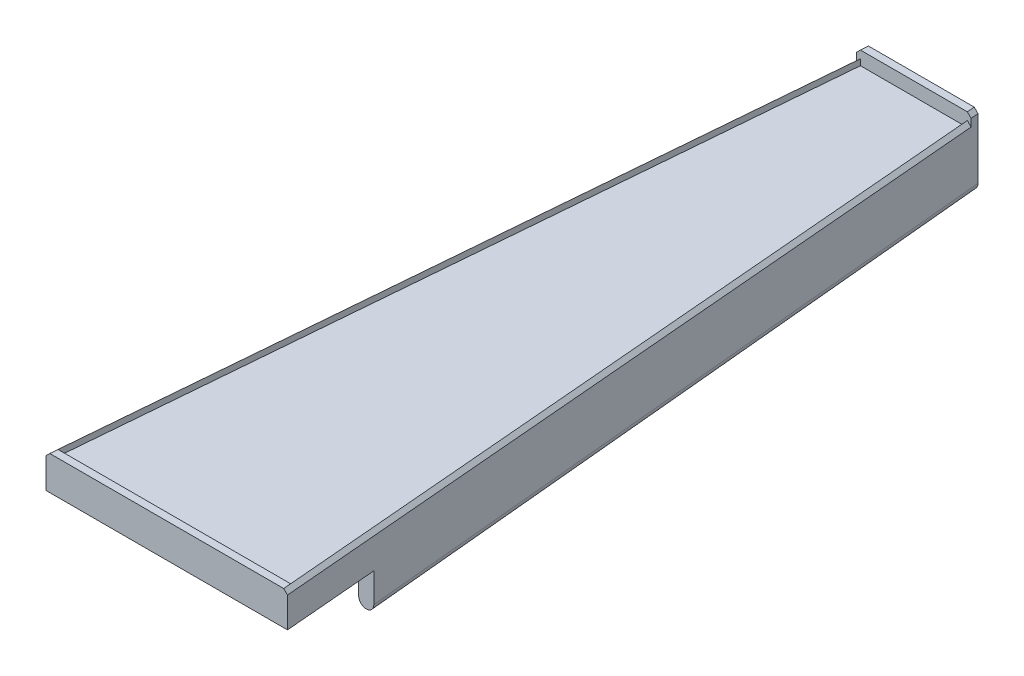
ISO-10303-21;
HEADER;
FILE_DESCRIPTION(('STEP AP214'),'2;1');
FILE_NAME('part.step','',(''),(''),'','','');
FILE_SCHEMA(('AUTOMOTIVE_DESIGN { 1 0 10303 214 1 1 1 1 }'));
ENDSEC;
DATA;
#1=APPLICATION_CONTEXT('core data for automotive mechanical design processes');
#2=APPLICATION_PROTOCOL_DEFINITION('international standard','automotive_design',2000,#1);
#3=PRODUCT_CONTEXT('',#1,'mechanical');
#4=PRODUCT('Part','Part','',(#3));
#5=PRODUCT_RELATED_PRODUCT_CATEGORY('part','',(#4));
#6=PRODUCT_DEFINITION_FORMATION('','',#4);
#7=PRODUCT_DEFINITION_CONTEXT('part definition',#1,'design');
#8=PRODUCT_DEFINITION('design','',#6,#7);
#9=PRODUCT_DEFINITION_SHAPE('','',#8);
#10=(LENGTH_UNIT() NAMED_UNIT(*) SI_UNIT(.MILLI.,.METRE.));
#11=(NAMED_UNIT(*) PLANE_ANGLE_UNIT() SI_UNIT($,.RADIAN.));
#12=(NAMED_UNIT(*) SI_UNIT($,.STERADIAN.) SOLID_ANGLE_UNIT());
#13=UNCERTAINTY_MEASURE_WITH_UNIT(LENGTH_MEASURE(1.E-05),#10,'distance_accuracy_value','');
#14=(GEOMETRIC_REPRESENTATION_CONTEXT(3) GLOBAL_UNCERTAINTY_ASSIGNED_CONTEXT((#13)) GLOBAL_UNIT_ASSIGNED_CONTEXT((#10,
#11,#12)) REPRESENTATION_CONTEXT('',''));
#15=CARTESIAN_POINT('',(0.,0.,0.));
#16=DIRECTION('',(0.,0.,1.));
#17=DIRECTION('',(1.,0.,0.));
#18=AXIS2_PLACEMENT_3D('',#15,#16,#17);
#19=CARTESIAN_POINT('',(-13.0071860837691,3.99840610567133,0.169389182879624));
#20=DIRECTION('',(-0.0846903873997294,-0.00996357498820347,0.996357498820347));
#21=DIRECTION('',(0.99640695811543,0.,0.0846945914398114));
#22=AXIS2_PLACEMENT_3D('',#19,#20,#21);
#23=CYLINDRICAL_SURFACE('',#22,2.);
#24=CARTESIAN_POINT('',(-27.8677880032243,2.25009999750012,175.));
#25=DIRECTION('',(0.,0.,-1.));
#26=DIRECTION('',(-0.993150604322876,-0.116841247567397,0.));
#27=AXIS2_PLACEMENT_3D('',#24,#25,#26);
#28=ELLIPSE('',#27,2.00731163499841,2.);
#29=CARTESIAN_POINT('',(-29.875,2.24840610567133,175.));
#30=VERTEX_POINT('',#29);
#31=CARTESIAN_POINT('',(-25.8605760064487,2.25179388932892,175.));
#32=VERTEX_POINT('',#31);
#33=EDGE_CURVE('E348',#30,#32,#28,.F.);
#34=ORIENTED_EDGE('',*,*,#33,.F.);
#35=DIRECTION('',(-0.0846903873997294,-0.00996357498820347,0.996357498820347));
#36=VECTOR('',#35,1.);
#37=CARTESIAN_POINT('',(-31.9856537316058,2.000093901953,199.831220371833));
#38=LINE('',#37,#36);
#39=CARTESIAN_POINT('',(-15.,3.99840610567133,0.));
#40=VERTEX_POINT('',#39);
#41=EDGE_CURVE('E237',#40,#30,#38,.T.);
#42=ORIENTED_EDGE('',*,*,#41,.F.);
#43=CARTESIAN_POINT('',(-12.9927880032244,4.00009999750012,0.));
#44=DIRECTION('',(0.,0.,1.));
#45=DIRECTION('',(-0.993150604322876,-0.116841247567397,0.));
#46=AXIS2_PLACEMENT_3D('',#43,#44,#45);
#47=ELLIPSE('',#46,2.00731163499841,2.);
#48=CARTESIAN_POINT('',(-12.9944879182308,2.,0.));
#49=VERTEX_POINT('',#48);
#50=EDGE_CURVE('E245',#49,#40,#47,.F.);
#51=ORIENTED_EDGE('',*,*,#50,.F.);
#52=DIRECTION('',(-0.0846903873997294,-0.00996357498820347,0.996357498820347));
#53=VECTOR('',#52,1.);
#54=CARTESIAN_POINT('',(-13.1308042260666,1.98396278731343,1.60372126865746));
#55=LINE('',#54,#53);
#56=CARTESIAN_POINT('',(-13.3344879182307,1.96,4.));
#57=VERTEX_POINT('',#56);
#58=EDGE_CURVE('E240',#57,#49,#55,.F.);
#59=ORIENTED_EDGE('',*,*,#58,.F.);
#60=CARTESIAN_POINT('',(-13.3327880032244,3.96009999750012,4.));
#61=DIRECTION('',(0.,0.,1.));
#62=DIRECTION('',(-0.993150604322876,-0.116841247567397,0.));
#63=AXIS2_PLACEMENT_3D('',#60,#61,#62);
#64=ELLIPSE('',#63,2.00731163499841,2.);
#65=CARTESIAN_POINT('',(-11.3255760064487,3.96179388932892,4.));
#66=VERTEX_POINT('',#65);
#67=EDGE_CURVE('E248',#66,#57,#64,.F.);
#68=ORIENTED_EDGE('',*,*,#67,.F.);
#69=DIRECTION('',(0.0846903873997294,0.00996357498820347,-0.996357498820347));
#70=VECTOR('',#69,1.);
#71=CARTESIAN_POINT('',(-11.0143721675383,3.99840610567133,0.338778365759247));
#72=LINE('',#71,#70);
#73=EDGE_CURVE('E243',#32,#66,#72,.T.);
#74=ORIENTED_EDGE('',*,*,#73,.F.);
#75=EDGE_LOOP('',(#34,#42,#51,#59,#68,#74));
#76=FACE_BOUND('',#75,.T.);
#77=ADVANCED_FACE('F37',(#76),#23,.T.);
#78=CARTESIAN_POINT('',(-32.,2.,0.));
#79=DIRECTION('',(0.,0.999950003749687,0.00999950003749687));
#80=DIRECTION('',(0.,-0.00999950003749688,0.999950003749688));
#81=AXIS2_PLACEMENT_3D('',#78,#79,#80);
#82=PLANE('',#81);
#83=DIRECTION('',(1.,0.,0.));
#84=VECTOR('',#83,1.);
#85=CARTESIAN_POINT('',(-32.,1.96,4.));
#86=LINE('',#85,#84);
#87=CARTESIAN_POINT('',(13.3344879182308,1.96,4.));
#88=VERTEX_POINT('',#87);
#89=EDGE_CURVE('E325',#57,#88,#86,.T.);
#90=ORIENTED_EDGE('',*,*,#89,.F.);
#91=ORIENTED_EDGE('',*,*,#58,.T.);
#92=DIRECTION('',(1.,0.,0.));
#93=VECTOR('',#92,1.);
#94=CARTESIAN_POINT('',(-32.,2.,0.));
#95=LINE('',#94,#93);
#96=CARTESIAN_POINT('',(12.9944879182308,2.,0.));
#97=VERTEX_POINT('',#96);
#98=EDGE_CURVE('E329',#49,#97,#95,.T.);
#99=ORIENTED_EDGE('',*,*,#98,.T.);
#100=DIRECTION('',(-0.0846903873997296,0.00996357498820347,-0.996357498820347));
#101=VECTOR('',#100,1.);
#102=CARTESIAN_POINT('',(12.67176667612,2.03796720495421,-3.79672049542066));
#103=LINE('',#102,#101);
#104=EDGE_CURVE('E229',#97,#88,#103,.F.);
#105=ORIENTED_EDGE('',*,*,#104,.T.);
#106=EDGE_LOOP('',(#90,#91,#99,#105));
#107=FACE_BOUND('',#106,.T.);
#108=ADVANCED_FACE('F415',(#107),#82,.F.);
#109=CARTESIAN_POINT('',(30.0071860837692,1.99840610567133,200.16938918288));
#110=DIRECTION('',(-0.0846903873997296,0.00996357498820347,-0.996357498820347));
#111=DIRECTION('',(-0.99640695811543,0.,0.0846945914398116));
#112=AXIS2_PLACEMENT_3D('',#109,#110,#111);
#113=CYLINDRICAL_SURFACE('',#112,2.);
#114=CARTESIAN_POINT('',(27.8677880032244,2.25009999750013,175.));
#115=DIRECTION('',(0.,0.,-1.));
#116=DIRECTION('',(-0.993150604322876,0.116841247567397,0.));
#117=AXIS2_PLACEMENT_3D('',#114,#115,#116);
#118=ELLIPSE('',#117,2.00731163499841,2.);
#119=CARTESIAN_POINT('',(25.8605760064488,2.25179388932892,175.));
#120=VERTEX_POINT('',#119);
#121=CARTESIAN_POINT('',(29.875,2.24840610567133,175.));
#122=VERTEX_POINT('',#121);
#123=EDGE_CURVE('E291',#120,#122,#118,.F.);
#124=ORIENTED_EDGE('',*,*,#123,.F.);
#125=DIRECTION('',(0.0846903873997296,-0.00996357498820347,0.996357498820347));
#126=VECTOR('',#125,1.);
#127=CARTESIAN_POINT('',(28.0143721675383,1.99840610567133,200.338778365759));
#128=LINE('',#127,#126);
#129=CARTESIAN_POINT('',(11.3255760064487,3.96179388932892,4.));
#130=VERTEX_POINT('',#129);
#131=EDGE_CURVE('E232',#130,#120,#128,.T.);
#132=ORIENTED_EDGE('',*,*,#131,.F.);
#133=CARTESIAN_POINT('',(13.3327880032244,3.96009999750013,4.));
#134=DIRECTION('',(0.,0.,1.));
#135=DIRECTION('',(-0.993150604322876,0.116841247567397,0.));
#136=AXIS2_PLACEMENT_3D('',#133,#134,#135);
#137=ELLIPSE('',#136,2.00731163499841,2.);
#138=EDGE_CURVE('E235',#88,#130,#137,.F.);
#139=ORIENTED_EDGE('',*,*,#138,.F.);
#140=ORIENTED_EDGE('',*,*,#104,.F.);
#141=CARTESIAN_POINT('',(12.9927880032244,4.00009999750013,0.));
#142=DIRECTION('',(0.,0.,1.));
#143=DIRECTION('',(-0.993150604322876,0.116841247567397,0.));
#144=AXIS2_PLACEMENT_3D('',#141,#142,#143);
#145=ELLIPSE('',#144,2.00731163499841,2.);
#146=CARTESIAN_POINT('',(15.,3.99840610567133,0.));
#147=VERTEX_POINT('',#146);
#148=EDGE_CURVE('E226',#147,#97,#145,.F.);
#149=ORIENTED_EDGE('',*,*,#148,.F.);
#150=DIRECTION('',(-0.0846903873997296,0.00996357498820347,-0.996357498820347));
#151=VECTOR('',#150,1.);
#152=CARTESIAN_POINT('',(31.9856537316058,2.000093901953,199.831220371833));
#153=LINE('',#152,#151);
#154=EDGE_CURVE('E218',#122,#147,#153,.T.);
#155=ORIENTED_EDGE('',*,*,#154,.F.);
#156=EDGE_LOOP('',(#124,#132,#139,#140,#149,#155));
#157=FACE_BOUND('',#156,.T.);
#158=ADVANCED_FACE('F297',(#157),#113,.T.);
#159=CARTESIAN_POINT('',(-32.,19.,200.));
#160=DIRECTION('',(0.99640695811543,0.,0.0846945914398114));
#161=DIRECTION('',(0.0846945914398114,0.,-0.99640695811543));
#162=AXIS2_PLACEMENT_3D('',#159,#160,#161);
#163=PLANE('',#162);
#164=DIRECTION('',(0.,1.,0.));
#165=VECTOR('',#164,1.);
#166=CARTESIAN_POINT('',(-29.875,19.,175.));
#167=LINE('',#166,#165);
#168=CARTESIAN_POINT('',(-29.875,9.99920305283565,175.));
#169=VERTEX_POINT('',#168);
#170=EDGE_CURVE('E352',#30,#169,#167,.T.);
#171=ORIENTED_EDGE('',*,*,#170,.T.);
#172=DIRECTION('',(-0.0846945914398114,0.,0.99640695811543));
#173=VECTOR('',#172,1.);
#174=CARTESIAN_POINT('',(-32.,9.99920305283565,200.));
#175=LINE('',#174,#173);
#176=CARTESIAN_POINT('',(-32.,9.99920305283565,200.));
#177=VERTEX_POINT('',#176);
#178=EDGE_CURVE('E200',#169,#177,#175,.T.);
#179=ORIENTED_EDGE('',*,*,#178,.T.);
#180=DIRECTION('',(0.,-1.,0.));
#181=VECTOR('',#180,1.);
#182=CARTESIAN_POINT('',(-32.,19.,200.));
#183=LINE('',#182,#181);
#184=CARTESIAN_POINT('',(-32.,18.,200.));
#185=VERTEX_POINT('',#184);
#186=EDGE_CURVE('E210',#185,#177,#183,.T.);
#187=ORIENTED_EDGE('',*,*,#186,.F.);
#188=DIRECTION('',(0.0846945914398114,0.,-0.99640695811543));
#189=VECTOR('',#188,1.);
#190=CARTESIAN_POINT('',(-15.1692558885214,18.,1.9912457473105));
#191=LINE('',#190,#189);
#192=CARTESIAN_POINT('',(-15.1692558885214,18.,1.99124574731051));
#193=VERTEX_POINT('',#192);
#194=EDGE_CURVE('E263',#185,#193,#191,.T.);
#195=ORIENTED_EDGE('',*,*,#194,.T.);
#196=DIRECTION('',(0.,-1.,0.));
#197=VECTOR('',#196,1.);
#198=CARTESIAN_POINT('',(-15.1692558885214,21.,1.99124574731051));
#199=LINE('',#198,#197);
#200=CARTESIAN_POINT('',(-15.1692558885214,20.,1.99124574731051));
#201=VERTEX_POINT('',#200);
#202=EDGE_CURVE('E328',#201,#193,#199,.T.);
#203=ORIENTED_EDGE('',*,*,#202,.F.);
#204=DIRECTION('',(0.0846945914398114,0.,-0.99640695811543));
#205=VECTOR('',#204,1.);
#206=CARTESIAN_POINT('',(-15.,20.,0.));
#207=LINE('',#206,#205);
#208=CARTESIAN_POINT('',(-15.,20.,0.));
#209=VERTEX_POINT('',#208);
#210=EDGE_CURVE('E287',#201,#209,#207,.T.);
#211=ORIENTED_EDGE('',*,*,#210,.T.);
#212=DIRECTION('',(0.,-1.,0.));
#213=VECTOR('',#212,1.);
#214=CARTESIAN_POINT('',(-15.,19.,0.));
#215=LINE('',#214,#213);
#216=EDGE_CURVE('E221',#209,#40,#215,.T.);
#217=ORIENTED_EDGE('',*,*,#216,.T.);
#218=ORIENTED_EDGE('',*,*,#41,.T.);
#219=EDGE_LOOP('',(#171,#179,#187,#195,#203,#211,#217,#218));
#220=FACE_BOUND('',#219,.T.);
#221=ADVANCED_FACE('F336',(#220),#163,.F.);
#222=CARTESIAN_POINT('',(32.,19.,200.));
#223=DIRECTION('',(0.,0.,-1.));
#224=DIRECTION('',(-1.,0.,0.));
#225=AXIS2_PLACEMENT_3D('',#222,#223,#224);
#226=PLANE('',#225);
#227=ORIENTED_EDGE('',*,*,#186,.T.);
#228=DIRECTION('',(-1.,0.,0.));
#229=VECTOR('',#228,1.);
#230=CARTESIAN_POINT('',(-32.,9.99920305283565,200.));
#231=LINE('',#230,#229);
#232=CARTESIAN_POINT('',(32.,9.99920305283566,200.));
#233=VERTEX_POINT('',#232);
#234=EDGE_CURVE('E195',#233,#177,#231,.T.);
#235=ORIENTED_EDGE('',*,*,#234,.F.);
#236=DIRECTION('',(0.,-1.,0.));
#237=VECTOR('',#236,1.);
#238=CARTESIAN_POINT('',(32.,19.,200.));
#239=LINE('',#238,#237);
#240=CARTESIAN_POINT('',(32.,18.,200.));
#241=VERTEX_POINT('',#240);
#242=EDGE_CURVE('E207',#241,#233,#239,.T.);
#243=ORIENTED_EDGE('',*,*,#242,.F.);
#244=DIRECTION('',(-0.708378252354539,0.705833019623713,0.));
#245=VECTOR('',#244,1.);
#246=CARTESIAN_POINT('',(22.4154183029927,27.550143893524,200.));
#247=LINE('',#246,#245);
#248=CARTESIAN_POINT('',(30.9963940016122,19.,200.));
#249=VERTEX_POINT('',#248);
#250=EDGE_CURVE('E261',#241,#249,#247,.T.);
#251=ORIENTED_EDGE('',*,*,#250,.T.);
#252=DIRECTION('',(1.,0.,0.));
#253=VECTOR('',#252,1.);
#254=CARTESIAN_POINT('',(32.,19.,200.));
#255=LINE('',#254,#253);
#256=CARTESIAN_POINT('',(-30.9963940016121,19.,200.));
#257=VERTEX_POINT('',#256);
#258=EDGE_CURVE('E331',#257,#249,#255,.T.);
#259=ORIENTED_EDGE('',*,*,#258,.F.);
#260=DIRECTION('',(-0.708378252354539,-0.705833019623713,0.));
#261=VECTOR('',#260,1.);
#262=CARTESIAN_POINT('',(-22.4154183029926,27.5501438935239,200.));
#263=LINE('',#262,#261);
#264=EDGE_CURVE('E259',#257,#185,#263,.T.);
#265=ORIENTED_EDGE('',*,*,#264,.T.);
#266=EDGE_LOOP('',(#227,#235,#243,#251,#259,#265));
#267=FACE_BOUND('',#266,.T.);
#268=ADVANCED_FACE('F206',(#267),#226,.F.);
#269=CARTESIAN_POINT('',(32.,19.,200.));
#270=DIRECTION('',(-0.99640695811543,0.,0.0846945914398116));
#271=DIRECTION('',(0.0846945914398116,0.,0.99640695811543));
#272=AXIS2_PLACEMENT_3D('',#269,#270,#271);
#273=PLANE('',#272);
#274=ORIENTED_EDGE('',*,*,#242,.T.);
#275=DIRECTION('',(-0.0846945914398116,0.,-0.99640695811543));
#276=VECTOR('',#275,1.);
#277=CARTESIAN_POINT('',(32.,9.99920305283566,200.));
#278=LINE('',#277,#276);
#279=CARTESIAN_POINT('',(29.875,9.99920305283566,175.));
#280=VERTEX_POINT('',#279);
#281=EDGE_CURVE('E191',#233,#280,#278,.T.);
#282=ORIENTED_EDGE('',*,*,#281,.T.);
#283=DIRECTION('',(0.,-1.,0.));
#284=VECTOR('',#283,1.);
#285=CARTESIAN_POINT('',(29.875,19.,175.));
#286=LINE('',#285,#284);
#287=EDGE_CURVE('E301',#280,#122,#286,.T.);
#288=ORIENTED_EDGE('',*,*,#287,.T.);
#289=ORIENTED_EDGE('',*,*,#154,.T.);
#290=DIRECTION('',(0.,-1.,0.));
#291=VECTOR('',#290,1.);
#292=CARTESIAN_POINT('',(15.,19.,0.));
#293=LINE('',#292,#291);
#294=CARTESIAN_POINT('',(15.,20.,0.));
#295=VERTEX_POINT('',#294);
#296=EDGE_CURVE('E216',#295,#147,#293,.T.);
#297=ORIENTED_EDGE('',*,*,#296,.F.);
#298=DIRECTION('',(0.0846945914398116,0.,0.99640695811543));
#299=VECTOR('',#298,1.);
#300=CARTESIAN_POINT('',(15.1692558885214,20.,1.99124574731051));
#301=LINE('',#300,#299);
#302=CARTESIAN_POINT('',(15.1692558885214,20.,1.99124574731051));
#303=VERTEX_POINT('',#302);
#304=EDGE_CURVE('E282',#295,#303,#301,.T.);
#305=ORIENTED_EDGE('',*,*,#304,.T.);
#306=DIRECTION('',(0.,-1.,0.));
#307=VECTOR('',#306,1.);
#308=CARTESIAN_POINT('',(15.1692558885214,21.,1.99124574731051));
#309=LINE('',#308,#307);
#310=CARTESIAN_POINT('',(15.1692558885214,18.,1.99124574731051));
#311=VERTEX_POINT('',#310);
#312=EDGE_CURVE('E395',#303,#311,#309,.T.);
#313=ORIENTED_EDGE('',*,*,#312,.T.);
#314=DIRECTION('',(0.0846945914398116,0.,0.99640695811543));
#315=VECTOR('',#314,1.);
#316=CARTESIAN_POINT('',(32.,18.,200.));
#317=LINE('',#316,#315);
#318=EDGE_CURVE('E215',#311,#241,#317,.T.);
#319=ORIENTED_EDGE('',*,*,#318,.T.);
#320=EDGE_LOOP('',(#274,#282,#288,#289,#297,#305,#313,#319));
#321=FACE_BOUND('',#320,.T.);
#322=ADVANCED_FACE('F213',(#321),#273,.F.);
#323=CARTESIAN_POINT('',(15.,19.,0.));
#324=DIRECTION('',(0.,0.,1.));
#325=DIRECTION('',(1.,0.,0.));
#326=AXIS2_PLACEMENT_3D('',#323,#324,#325);
#327=PLANE('',#326);
#328=DIRECTION('',(-1.,0.,0.));
#329=VECTOR('',#328,1.);
#330=CARTESIAN_POINT('',(15.,21.,0.));
#331=LINE('',#330,#329);
#332=CARTESIAN_POINT('',(13.9963940016121,21.,0.));
#333=VERTEX_POINT('',#332);
#334=CARTESIAN_POINT('',(-13.9963940016122,21.,0.));
#335=VERTEX_POINT('',#334);
#336=EDGE_CURVE('E384',#333,#335,#331,.T.);
#337=ORIENTED_EDGE('',*,*,#336,.F.);
#338=DIRECTION('',(0.708378252354546,-0.705833019623706,0.));
#339=VECTOR('',#338,1.);
#340=CARTESIAN_POINT('',(13.9460140259434,21.050198958306,0.));
#341=LINE('',#340,#339);
#342=EDGE_CURVE('E280',#333,#295,#341,.T.);
#343=ORIENTED_EDGE('',*,*,#342,.T.);
#344=ORIENTED_EDGE('',*,*,#296,.T.);
#345=ORIENTED_EDGE('',*,*,#148,.T.);
#346=ORIENTED_EDGE('',*,*,#98,.F.);
#347=ORIENTED_EDGE('',*,*,#50,.T.);
#348=ORIENTED_EDGE('',*,*,#216,.F.);
#349=DIRECTION('',(0.708378252354538,0.705833019623714,0.));
#350=VECTOR('',#349,1.);
#351=CARTESIAN_POINT('',(-13.9460140259434,21.050198958306,0.));
#352=LINE('',#351,#350);
#353=EDGE_CURVE('E278',#209,#335,#352,.T.);
#354=ORIENTED_EDGE('',*,*,#353,.T.);
#355=EDGE_LOOP('',(#337,#343,#344,#345,#346,#347,#348,#354));
#356=FACE_BOUND('',#355,.T.);
#357=ADVANCED_FACE('F343',(#356),#327,.F.);
#358=CARTESIAN_POINT('',(0.,19.,0.));
#359=DIRECTION('',(0.,1.,0.));
#360=DIRECTION('',(0.,0.,1.));
#361=AXIS2_PLACEMENT_3D('',#358,#359,#360);
#362=PLANE('',#361);
#363=DIRECTION('',(1.,0.,0.));
#364=VECTOR('',#363,1.);
#365=CARTESIAN_POINT('',(-30.8256498901335,19.,197.991245747311));
#366=LINE('',#365,#364);
#367=CARTESIAN_POINT('',(-30.8256498901335,19.,197.991245747311));
#368=VERTEX_POINT('',#367);
#369=CARTESIAN_POINT('',(30.8256498901336,19.,197.991245747311));
#370=VERTEX_POINT('',#369);
#371=EDGE_CURVE('E363',#368,#370,#366,.T.);
#372=ORIENTED_EDGE('',*,*,#371,.F.);
#373=DIRECTION('',(-0.0846945914398114,0.,0.99640695811543));
#374=VECTOR('',#373,1.);
#375=CARTESIAN_POINT('',(-31.0035930418845,19.,200.08469459144));
#376=LINE('',#375,#374);
#377=EDGE_CURVE('E251',#368,#257,#376,.T.);
#378=ORIENTED_EDGE('',*,*,#377,.T.);
#379=ORIENTED_EDGE('',*,*,#258,.T.);
#380=DIRECTION('',(-0.0846945914398116,0.,-0.99640695811543));
#381=VECTOR('',#380,1.);
#382=CARTESIAN_POINT('',(14.172848930406,19.,2.07594033875032));
#383=LINE('',#382,#381);
#384=EDGE_CURVE('E255',#249,#370,#383,.T.);
#385=ORIENTED_EDGE('',*,*,#384,.T.);
#386=EDGE_LOOP('',(#372,#378,#379,#385));
#387=FACE_BOUND('',#386,.T.);
#388=ADVANCED_FACE('F427',(#387),#362,.T.);
#389=CARTESIAN_POINT('',(-28.0143721675383,19.,200.338778365759));
#390=DIRECTION('',(0.99640695811543,0.,0.0846945914398114));
#391=DIRECTION('',(0.0846945914398114,0.,-0.99640695811543));
#392=AXIS2_PLACEMENT_3D('',#389,#390,#391);
#393=PLANE('',#392);
#394=DIRECTION('',(-0.0846945914398114,0.,0.99640695811543));
#395=VECTOR('',#394,1.);
#396=CARTESIAN_POINT('',(-28.0143721675383,9.99920305283565,200.338778365759));
#397=LINE('',#396,#395);
#398=CARTESIAN_POINT('',(-25.8605760064487,9.99920305283565,175.));
#399=VERTEX_POINT('',#398);
#400=CARTESIAN_POINT('',(-27.6455760064487,9.99920305283565,196.));
#401=VERTEX_POINT('',#400);
#402=EDGE_CURVE('E201',#399,#401,#397,.T.);
#403=ORIENTED_EDGE('',*,*,#402,.F.);
#404=DIRECTION('',(0.,1.,0.));
#405=VECTOR('',#404,1.);
#406=CARTESIAN_POINT('',(-25.8605760064487,19.,175.));
#407=LINE('',#406,#405);
#408=EDGE_CURVE('E353',#32,#399,#407,.T.);
#409=ORIENTED_EDGE('',*,*,#408,.F.);
#410=ORIENTED_EDGE('',*,*,#73,.T.);
#411=DIRECTION('',(0.,-1.,0.));
#412=VECTOR('',#411,1.);
#413=CARTESIAN_POINT('',(-11.3255760064487,19.,4.));
#414=LINE('',#413,#412);
#415=CARTESIAN_POINT('',(-11.3255760064488,10.,4.));
#416=VERTEX_POINT('',#415);
#417=EDGE_CURVE('E312',#416,#66,#414,.T.);
#418=ORIENTED_EDGE('',*,*,#417,.F.);
#419=DIRECTION('',(-0.0846945914398114,0.,0.99640695811543));
#420=VECTOR('',#419,1.);
#421=CARTESIAN_POINT('',(-28.0143721675383,10.,200.338778365759));
#422=LINE('',#421,#420);
#423=CARTESIAN_POINT('',(-27.6455760064487,10.,196.));
#424=VERTEX_POINT('',#423);
#425=EDGE_CURVE('E327',#416,#424,#422,.T.);
#426=ORIENTED_EDGE('',*,*,#425,.T.);
#427=DIRECTION('',(0.,-1.,0.));
#428=VECTOR('',#427,1.);
#429=CARTESIAN_POINT('',(-27.6455760064487,19.,196.));
#430=LINE('',#429,#428);
#431=EDGE_CURVE('E315',#424,#401,#430,.T.);
#432=ORIENTED_EDGE('',*,*,#431,.T.);
#433=EDGE_LOOP('',(#403,#409,#410,#418,#426,#432));
#434=FACE_BOUND('',#433,.T.);
#435=ADVANCED_FACE('F412',(#434),#393,.T.);
#436=CARTESIAN_POINT('',(32.,19.,196.));
#437=DIRECTION('',(0.,0.,-1.));
#438=DIRECTION('',(-1.,0.,0.));
#439=AXIS2_PLACEMENT_3D('',#436,#437,#438);
#440=PLANE('',#439);
#441=DIRECTION('',(1.,0.,0.));
#442=VECTOR('',#441,1.);
#443=CARTESIAN_POINT('',(32.,9.99920305283566,196.));
#444=LINE('',#443,#442);
#445=CARTESIAN_POINT('',(27.6455760064488,9.99920305283566,196.));
#446=VERTEX_POINT('',#445);
#447=EDGE_CURVE('E355',#401,#446,#444,.T.);
#448=ORIENTED_EDGE('',*,*,#447,.F.);
#449=ORIENTED_EDGE('',*,*,#431,.F.);
#450=DIRECTION('',(1.,0.,0.));
#451=VECTOR('',#450,1.);
#452=CARTESIAN_POINT('',(32.,10.,196.));
#453=LINE('',#452,#451);
#454=CARTESIAN_POINT('',(27.6455760064488,10.,196.));
#455=VERTEX_POINT('',#454);
#456=EDGE_CURVE('E322',#424,#455,#453,.T.);
#457=ORIENTED_EDGE('',*,*,#456,.T.);
#458=DIRECTION('',(0.,-1.,0.));
#459=VECTOR('',#458,1.);
#460=CARTESIAN_POINT('',(27.6455760064488,19.,196.));
#461=LINE('',#460,#459);
#462=EDGE_CURVE('E311',#455,#446,#461,.T.);
#463=ORIENTED_EDGE('',*,*,#462,.T.);
#464=EDGE_LOOP('',(#448,#449,#457,#463));
#465=FACE_BOUND('',#464,.T.);
#466=ADVANCED_FACE('F407',(#465),#440,.T.);
#467=CARTESIAN_POINT('',(28.0143721675383,19.,200.338778365759));
#468=DIRECTION('',(-0.99640695811543,0.,0.0846945914398116));
#469=DIRECTION('',(0.0846945914398116,0.,0.99640695811543));
#470=AXIS2_PLACEMENT_3D('',#467,#468,#469);
#471=PLANE('',#470);
#472=DIRECTION('',(-0.0846945914398116,0.,-0.99640695811543));
#473=VECTOR('',#472,1.);
#474=CARTESIAN_POINT('',(28.0143721675383,9.99920305283566,200.338778365759));
#475=LINE('',#474,#473);
#476=CARTESIAN_POINT('',(25.8605760064488,9.99920305283566,175.));
#477=VERTEX_POINT('',#476);
#478=EDGE_CURVE('E11',#446,#477,#475,.T.);
#479=ORIENTED_EDGE('',*,*,#478,.F.);
#480=ORIENTED_EDGE('',*,*,#462,.F.);
#481=DIRECTION('',(-0.0846945914398116,0.,-0.99640695811543));
#482=VECTOR('',#481,1.);
#483=CARTESIAN_POINT('',(28.0143721675383,10.,200.338778365759));
#484=LINE('',#483,#482);
#485=CARTESIAN_POINT('',(11.3255760064487,10.,4.));
#486=VERTEX_POINT('',#485);
#487=EDGE_CURVE('E308',#455,#486,#484,.T.);
#488=ORIENTED_EDGE('',*,*,#487,.T.);
#489=DIRECTION('',(0.,-1.,0.));
#490=VECTOR('',#489,1.);
#491=CARTESIAN_POINT('',(11.3255760064487,19.,4.));
#492=LINE('',#491,#490);
#493=EDGE_CURVE('E305',#486,#130,#492,.T.);
#494=ORIENTED_EDGE('',*,*,#493,.T.);
#495=ORIENTED_EDGE('',*,*,#131,.T.);
#496=DIRECTION('',(0.,-1.,0.));
#497=VECTOR('',#496,1.);
#498=CARTESIAN_POINT('',(25.8605760064488,19.,175.));
#499=LINE('',#498,#497);
#500=EDGE_CURVE('E46',#477,#120,#499,.T.);
#501=ORIENTED_EDGE('',*,*,#500,.F.);
#502=EDGE_LOOP('',(#479,#480,#488,#494,#495,#501));
#503=FACE_BOUND('',#502,.T.);
#504=ADVANCED_FACE('F303',(#503),#471,.T.);
#505=CARTESIAN_POINT('',(15.,19.,4.));
#506=DIRECTION('',(0.,0.,1.));
#507=DIRECTION('',(1.,0.,0.));
#508=AXIS2_PLACEMENT_3D('',#505,#506,#507);
#509=PLANE('',#508);
#510=ORIENTED_EDGE('',*,*,#493,.F.);
#511=DIRECTION('',(-1.,0.,0.));
#512=VECTOR('',#511,1.);
#513=CARTESIAN_POINT('',(15.,10.,4.));
#514=LINE('',#513,#512);
#515=EDGE_CURVE('E318',#486,#416,#514,.T.);
#516=ORIENTED_EDGE('',*,*,#515,.T.);
#517=ORIENTED_EDGE('',*,*,#417,.T.);
#518=ORIENTED_EDGE('',*,*,#67,.T.);
#519=ORIENTED_EDGE('',*,*,#89,.T.);
#520=ORIENTED_EDGE('',*,*,#138,.T.);
#521=EDGE_LOOP('',(#510,#516,#517,#518,#519,#520));
#522=FACE_BOUND('',#521,.T.);
#523=ADVANCED_FACE('F410',(#522),#509,.T.);
#524=CARTESIAN_POINT('',(0.,10.,0.));
#525=DIRECTION('',(0.,1.,0.));
#526=DIRECTION('',(0.,0.,1.));
#527=AXIS2_PLACEMENT_3D('',#524,#525,#526);
#528=PLANE('',#527);
#529=ORIENTED_EDGE('',*,*,#425,.F.);
#530=ORIENTED_EDGE('',*,*,#515,.F.);
#531=ORIENTED_EDGE('',*,*,#487,.F.);
#532=ORIENTED_EDGE('',*,*,#456,.F.);
#533=EDGE_LOOP('',(#529,#530,#531,#532));
#534=FACE_BOUND('',#533,.T.);
#535=ADVANCED_FACE('F409',(#534),#528,.F.);
#536=CARTESIAN_POINT('',(-15.1692558885214,21.,1.99124574731051));
#537=DIRECTION('',(0.,0.,-1.));
#538=DIRECTION('',(-1.,0.,0.));
#539=AXIS2_PLACEMENT_3D('',#536,#537,#538);
#540=PLANE('',#539);
#541=ORIENTED_EDGE('',*,*,#312,.F.);
#542=DIRECTION('',(-0.708378252354546,0.705833019623706,0.));
#543=VECTOR('',#542,1.);
#544=CARTESIAN_POINT('',(14.0303373521881,21.1348263543291,1.99124574731051));
#545=LINE('',#544,#543);
#546=CARTESIAN_POINT('',(14.1656498901335,21.,1.99124574731051));
#547=VERTEX_POINT('',#546);
#548=EDGE_CURVE('E285',#303,#547,#545,.T.);
#549=ORIENTED_EDGE('',*,*,#548,.T.);
#550=DIRECTION('',(1.,0.,0.));
#551=VECTOR('',#550,1.);
#552=CARTESIAN_POINT('',(-15.1692558885214,21.,1.99124574731051));
#553=LINE('',#552,#551);
#554=CARTESIAN_POINT('',(-14.1656498901336,21.,1.99124574731051));
#555=VERTEX_POINT('',#554);
#556=EDGE_CURVE('E392',#555,#547,#553,.T.);
#557=ORIENTED_EDGE('',*,*,#556,.F.);
#558=DIRECTION('',(-0.708378252354538,-0.705833019623714,0.));
#559=VECTOR('',#558,1.);
#560=CARTESIAN_POINT('',(-14.0303373521881,21.1348263543291,1.99124574731051));
#561=LINE('',#560,#559);
#562=EDGE_CURVE('E60',#555,#201,#561,.T.);
#563=ORIENTED_EDGE('',*,*,#562,.T.);
#564=ORIENTED_EDGE('',*,*,#202,.T.);
#565=DIRECTION('',(0.708378252354539,0.705833019623713,0.));
#566=VECTOR('',#565,1.);
#567=CARTESIAN_POINT('',(-13.6692656058359,19.4946007547734,1.99124574731051));
#568=LINE('',#567,#566);
#569=CARTESIAN_POINT('',(-14.1656498901336,19.,1.99124574731051));
#570=VERTEX_POINT('',#569);
#571=EDGE_CURVE('E269',#193,#570,#568,.T.);
#572=ORIENTED_EDGE('',*,*,#571,.T.);
#573=DIRECTION('',(0.,1.,0.));
#574=VECTOR('',#573,1.);
#575=CARTESIAN_POINT('',(-14.1656498901336,17.4,1.99124574731051));
#576=LINE('',#575,#574);
#577=CARTESIAN_POINT('',(-14.1656498901336,17.4,1.99124574731051));
#578=VERTEX_POINT('',#577);
#579=EDGE_CURVE('E382',#578,#570,#576,.T.);
#580=ORIENTED_EDGE('',*,*,#579,.F.);
#581=DIRECTION('',(-1.,0.,0.));
#582=VECTOR('',#581,1.);
#583=CARTESIAN_POINT('',(-14.1656498901336,17.4,1.99124574731051));
#584=LINE('',#583,#582);
#585=CARTESIAN_POINT('',(14.1656498901336,17.4,1.99124574731051));
#586=VERTEX_POINT('',#585);
#587=EDGE_CURVE('E374',#586,#578,#584,.T.);
#588=ORIENTED_EDGE('',*,*,#587,.F.);
#589=DIRECTION('',(0.,1.,0.));
#590=VECTOR('',#589,1.);
#591=CARTESIAN_POINT('',(14.1656498901336,17.4,1.99124574731051));
#592=LINE('',#591,#590);
#593=CARTESIAN_POINT('',(14.1656498901336,19.,1.99124574731051));
#594=VERTEX_POINT('',#593);
#595=EDGE_CURVE('E385',#586,#594,#592,.T.);
#596=ORIENTED_EDGE('',*,*,#595,.T.);
#597=DIRECTION('',(0.708378252354539,-0.705833019623713,0.));
#598=VECTOR('',#597,1.);
#599=CARTESIAN_POINT('',(-1.55459197098376,34.6637583736748,1.99124574731051));
#600=LINE('',#599,#598);
#601=EDGE_CURVE('E266',#594,#311,#600,.T.);
#602=ORIENTED_EDGE('',*,*,#601,.T.);
#603=EDGE_LOOP('',(#541,#549,#557,#563,#564,#572,#580,#588,#596,#602));
#604=FACE_BOUND('',#603,.T.);
#605=ADVANCED_FACE('F474',(#604),#540,.F.);
#606=CARTESIAN_POINT('',(0.,21.,0.));
#607=DIRECTION('',(0.,1.,0.));
#608=DIRECTION('',(0.,0.,1.));
#609=AXIS2_PLACEMENT_3D('',#606,#607,#608);
#610=PLANE('',#609);
#611=ORIENTED_EDGE('',*,*,#556,.T.);
#612=DIRECTION('',(-0.0846945914398116,0.,-0.99640695811543));
#613=VECTOR('',#612,1.);
#614=CARTESIAN_POINT('',(14.0035930418845,21.,0.0846945914398137));
#615=LINE('',#614,#613);
#616=EDGE_CURVE('E275',#547,#333,#615,.T.);
#617=ORIENTED_EDGE('',*,*,#616,.T.);
#618=ORIENTED_EDGE('',*,*,#336,.T.);
#619=DIRECTION('',(-0.0846945914398114,0.,0.99640695811543));
#620=VECTOR('',#619,1.);
#621=CARTESIAN_POINT('',(-14.1728489304059,21.,2.07594033875032));
#622=LINE('',#621,#620);
#623=EDGE_CURVE('E272',#335,#555,#622,.T.);
#624=ORIENTED_EDGE('',*,*,#623,.T.);
#625=EDGE_LOOP('',(#611,#617,#618,#624));
#626=FACE_BOUND('',#625,.T.);
#627=ADVANCED_FACE('F453',(#626),#610,.T.);
#628=CARTESIAN_POINT('',(13.8959954345972,19.,-1.18115961194077));
#629=DIRECTION('',(0.704566116904882,0.707106781186546,-0.059888119936915));
#630=DIRECTION('',(0.0846945914398116,0.,0.99640695811543));
#631=AXIS2_PLACEMENT_3D('',#628,#629,#630);
#632=PLANE('',#631);
#633=ORIENTED_EDGE('',*,*,#250,.F.);
#634=ORIENTED_EDGE('',*,*,#318,.F.);
#635=ORIENTED_EDGE('',*,*,#601,.F.);
#636=DIRECTION('',(-0.0846945914398117,0.,-0.99640695811543));
#637=VECTOR('',#636,1.);
#638=CARTESIAN_POINT('',(30.8256498901336,19.,197.991245747311));
#639=LINE('',#638,#637);
#640=EDGE_CURVE('E368',#370,#594,#639,.T.);
#641=ORIENTED_EDGE('',*,*,#640,.F.);
#642=ORIENTED_EDGE('',*,*,#384,.F.);
#643=EDGE_LOOP('',(#633,#634,#635,#641,#642));
#644=FACE_BOUND('',#643,.T.);
#645=ADVANCED_FACE('F446',(#644),#632,.T.);
#646=CARTESIAN_POINT('',(-13.8959954345972,19.,-1.18115961194076));
#647=DIRECTION('',(-0.704566116904882,0.707106781186546,-0.0598881199369148));
#648=DIRECTION('',(0.0846945914398114,0.,-0.99640695811543));
#649=AXIS2_PLACEMENT_3D('',#646,#647,#648);
#650=PLANE('',#649);
#651=ORIENTED_EDGE('',*,*,#571,.F.);
#652=ORIENTED_EDGE('',*,*,#194,.F.);
#653=ORIENTED_EDGE('',*,*,#264,.F.);
#654=ORIENTED_EDGE('',*,*,#377,.F.);
#655=EDGE_CURVE('E252',#570,#368,#376,.T.);
#656=ORIENTED_EDGE('',*,*,#655,.F.);
#657=EDGE_LOOP('',(#651,#652,#653,#654,#656));
#658=FACE_BOUND('',#657,.T.);
#659=ADVANCED_FACE('F452',(#658),#650,.T.);
#660=CARTESIAN_POINT('',(13.8959954345972,21.,-1.18115961194076));
#661=DIRECTION('',(0.704566116904874,0.707106781186554,-0.0598881199369144));
#662=DIRECTION('',(0.0846945914398116,0.,0.99640695811543));
#663=AXIS2_PLACEMENT_3D('',#660,#661,#662);
#664=PLANE('',#663);
#665=ORIENTED_EDGE('',*,*,#548,.F.);
#666=ORIENTED_EDGE('',*,*,#304,.F.);
#667=ORIENTED_EDGE('',*,*,#342,.F.);
#668=ORIENTED_EDGE('',*,*,#616,.F.);
#669=EDGE_LOOP('',(#665,#666,#667,#668));
#670=FACE_BOUND('',#669,.T.);
#671=ADVANCED_FACE('F459',(#670),#664,.T.);
#672=CARTESIAN_POINT('',(-13.8959954345972,21.,-1.18115961194076));
#673=DIRECTION('',(-0.704566116904883,0.707106781186545,-0.0598881199369149));
#674=DIRECTION('',(0.0846945914398114,0.,-0.99640695811543));
#675=AXIS2_PLACEMENT_3D('',#672,#673,#674);
#676=PLANE('',#675);
#677=ORIENTED_EDGE('',*,*,#353,.F.);
#678=ORIENTED_EDGE('',*,*,#210,.F.);
#679=ORIENTED_EDGE('',*,*,#562,.F.);
#680=ORIENTED_EDGE('',*,*,#623,.F.);
#681=EDGE_LOOP('',(#677,#678,#679,#680));
#682=FACE_BOUND('',#681,.T.);
#683=ADVANCED_FACE('F40',(#682),#676,.T.);
#684=CARTESIAN_POINT('',(-14.1656498901336,17.4,1.99124574731051));
#685=DIRECTION('',(-0.99640695811543,0.,-0.0846945914398113));
#686=DIRECTION('',(-0.0846945914398113,0.,0.99640695811543));
#687=AXIS2_PLACEMENT_3D('',#684,#685,#686);
#688=PLANE('',#687);
#689=ORIENTED_EDGE('',*,*,#655,.T.);
#690=DIRECTION('',(0.,1.,0.));
#691=VECTOR('',#690,1.);
#692=CARTESIAN_POINT('',(-30.8256498901335,17.4,197.991245747311));
#693=LINE('',#692,#691);
#694=CARTESIAN_POINT('',(-30.8256498901335,17.4,197.991245747311));
#695=VERTEX_POINT('',#694);
#696=EDGE_CURVE('E377',#695,#368,#693,.T.);
#697=ORIENTED_EDGE('',*,*,#696,.F.);
#698=DIRECTION('',(-0.0846945914398114,0.,0.99640695811543));
#699=VECTOR('',#698,1.);
#700=CARTESIAN_POINT('',(-14.1656498901336,17.4,1.99124574731051));
#701=LINE('',#700,#699);
#702=EDGE_CURVE('E364',#578,#695,#701,.T.);
#703=ORIENTED_EDGE('',*,*,#702,.F.);
#704=ORIENTED_EDGE('',*,*,#579,.T.);
#705=EDGE_LOOP('',(#689,#697,#703,#704));
#706=FACE_BOUND('',#705,.T.);
#707=ADVANCED_FACE('F468',(#706),#688,.F.);
#708=CARTESIAN_POINT('',(30.8256498901336,17.4,197.991245747311));
#709=DIRECTION('',(0.996406958115429,0.,-0.0846945914398116));
#710=DIRECTION('',(-0.0846945914398116,0.,-0.99640695811543));
#711=AXIS2_PLACEMENT_3D('',#708,#709,#710);
#712=PLANE('',#711);
#713=ORIENTED_EDGE('',*,*,#640,.T.);
#714=ORIENTED_EDGE('',*,*,#595,.F.);
#715=DIRECTION('',(-0.0846945914398117,0.,-0.99640695811543));
#716=VECTOR('',#715,1.);
#717=CARTESIAN_POINT('',(30.8256498901336,17.4,197.991245747311));
#718=LINE('',#717,#716);
#719=CARTESIAN_POINT('',(30.8256498901336,17.4,197.991245747311));
#720=VERTEX_POINT('',#719);
#721=EDGE_CURVE('E371',#720,#586,#718,.T.);
#722=ORIENTED_EDGE('',*,*,#721,.F.);
#723=DIRECTION('',(0.,1.,0.));
#724=VECTOR('',#723,1.);
#725=CARTESIAN_POINT('',(30.8256498901336,17.4,197.991245747311));
#726=LINE('',#725,#724);
#727=EDGE_CURVE('E387',#720,#370,#726,.T.);
#728=ORIENTED_EDGE('',*,*,#727,.T.);
#729=EDGE_LOOP('',(#713,#714,#722,#728));
#730=FACE_BOUND('',#729,.T.);
#731=ADVANCED_FACE('F495',(#730),#712,.F.);
#732=CARTESIAN_POINT('',(-30.8256498901335,17.4,197.991245747311));
#733=DIRECTION('',(0.,0.,1.));
#734=DIRECTION('',(1.,0.,0.));
#735=AXIS2_PLACEMENT_3D('',#732,#733,#734);
#736=PLANE('',#735);
#737=ORIENTED_EDGE('',*,*,#371,.T.);
#738=ORIENTED_EDGE('',*,*,#727,.F.);
#739=DIRECTION('',(1.,0.,0.));
#740=VECTOR('',#739,1.);
#741=CARTESIAN_POINT('',(-30.8256498901335,17.4,197.991245747311));
#742=LINE('',#741,#740);
#743=EDGE_CURVE('E367',#695,#720,#742,.T.);
#744=ORIENTED_EDGE('',*,*,#743,.F.);
#745=ORIENTED_EDGE('',*,*,#696,.T.);
#746=EDGE_LOOP('',(#737,#738,#744,#745));
#747=FACE_BOUND('',#746,.T.);
#748=ADVANCED_FACE('F501',(#747),#736,.F.);
#749=CARTESIAN_POINT('',(0.,17.4,0.));
#750=DIRECTION('',(0.,1.,0.));
#751=DIRECTION('',(0.,0.,1.));
#752=AXIS2_PLACEMENT_3D('',#749,#750,#751);
#753=PLANE('',#752);
#754=ORIENTED_EDGE('',*,*,#702,.T.);
#755=ORIENTED_EDGE('',*,*,#743,.T.);
#756=ORIENTED_EDGE('',*,*,#721,.T.);
#757=ORIENTED_EDGE('',*,*,#587,.T.);
#758=EDGE_LOOP('',(#754,#755,#756,#757));
#759=FACE_BOUND('',#758,.T.);
#760=ADVANCED_FACE('F492',(#759),#753,.T.);
#761=CARTESIAN_POINT('',(-32.,9.99920305283565,175.));
#762=DIRECTION('',(0.,1.,0.));
#763=DIRECTION('',(-1.,0.,0.));
#764=AXIS2_PLACEMENT_3D('',#761,#762,#763);
#765=PLANE('',#764);
#766=DIRECTION('',(-1.,0.,0.));
#767=VECTOR('',#766,1.);
#768=CARTESIAN_POINT('',(-32.,9.99920305283565,175.));
#769=LINE('',#768,#767);
#770=EDGE_CURVE('E211',#399,#169,#769,.T.);
#771=ORIENTED_EDGE('',*,*,#770,.F.);
#772=ORIENTED_EDGE('',*,*,#402,.T.);
#773=ORIENTED_EDGE('',*,*,#447,.T.);
#774=ORIENTED_EDGE('',*,*,#478,.T.);
#775=EDGE_CURVE('E53',#280,#477,#769,.T.);
#776=ORIENTED_EDGE('',*,*,#775,.F.);
#777=ORIENTED_EDGE('',*,*,#281,.F.);
#778=ORIENTED_EDGE('',*,*,#234,.T.);
#779=ORIENTED_EDGE('',*,*,#178,.F.);
#780=EDGE_LOOP('',(#771,#772,#773,#774,#776,#777,#778,#779));
#781=FACE_BOUND('',#780,.T.);
#782=ADVANCED_FACE('F194',(#781),#765,.F.);
#783=CARTESIAN_POINT('',(0.,0.,175.));
#784=DIRECTION('',(0.,0.,-1.));
#785=DIRECTION('',(-1.,0.,0.));
#786=AXIS2_PLACEMENT_3D('',#783,#784,#785);
#787=PLANE('',#786);
#788=ORIENTED_EDGE('',*,*,#33,.T.);
#789=ORIENTED_EDGE('',*,*,#408,.T.);
#790=ORIENTED_EDGE('',*,*,#770,.T.);
#791=ORIENTED_EDGE('',*,*,#170,.F.);
#792=EDGE_LOOP('',(#788,#789,#790,#791));
#793=FACE_BOUND('',#792,.T.);
#794=ADVANCED_FACE('F480',(#793),#787,.F.);
#795=ORIENTED_EDGE('',*,*,#775,.T.);
#796=ORIENTED_EDGE('',*,*,#500,.T.);
#797=ORIENTED_EDGE('',*,*,#123,.T.);
#798=ORIENTED_EDGE('',*,*,#287,.F.);
#799=EDGE_LOOP('',(#795,#796,#797,#798));
#800=FACE_BOUND('',#799,.T.);
#801=ADVANCED_FACE('F290',(#800),#787,.F.);
#802=CLOSED_SHELL('',(#77,#108,#158,#221,#268,#322,#357,#388,#435,#466,#504,#523,#535,#605,#627,
#645,#659,#671,#683,#707,#731,#748,#760,#782,#794,#801));
#803=MANIFOLD_SOLID_BREP('B2',#802);
#804=ADVANCED_BREP_SHAPE_REPRESENTATION('',(#18,#803),#14);
#805=SHAPE_DEFINITION_REPRESENTATION(#9,#804);
ENDSEC;
END-ISO-10303-21;
